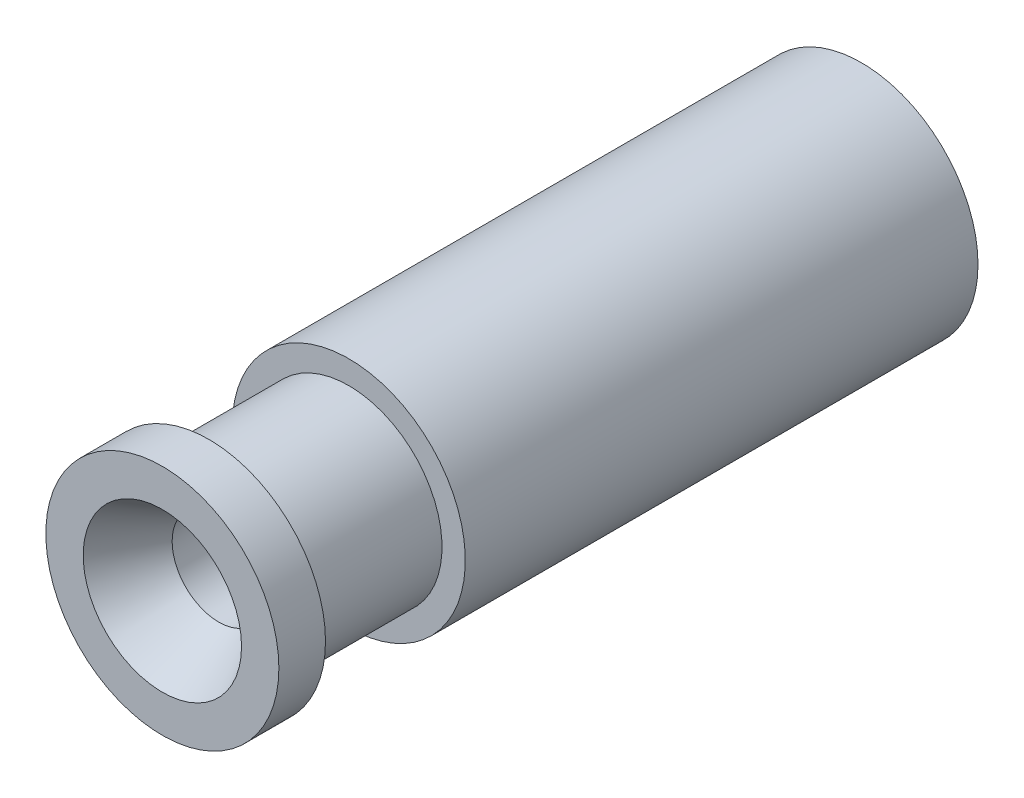
ISO-10303-21;
HEADER;
FILE_DESCRIPTION(('STEP AP214'),'2;1');
FILE_NAME('part.step','',(''),(''),'','','');
FILE_SCHEMA(('AUTOMOTIVE_DESIGN { 1 0 10303 214 1 1 1 1 }'));
ENDSEC;
DATA;
#1=APPLICATION_CONTEXT('core data for automotive mechanical design processes');
#2=APPLICATION_PROTOCOL_DEFINITION('international standard','automotive_design',2000,#1);
#3=PRODUCT_CONTEXT('',#1,'mechanical');
#4=PRODUCT('Part','Part','',(#3));
#5=PRODUCT_RELATED_PRODUCT_CATEGORY('part','',(#4));
#6=PRODUCT_DEFINITION_FORMATION('','',#4);
#7=PRODUCT_DEFINITION_CONTEXT('part definition',#1,'design');
#8=PRODUCT_DEFINITION('design','',#6,#7);
#9=PRODUCT_DEFINITION_SHAPE('','',#8);
#10=(LENGTH_UNIT() NAMED_UNIT(*) SI_UNIT(.MILLI.,.METRE.));
#11=(NAMED_UNIT(*) PLANE_ANGLE_UNIT() SI_UNIT($,.RADIAN.));
#12=(NAMED_UNIT(*) SI_UNIT($,.STERADIAN.) SOLID_ANGLE_UNIT());
#13=UNCERTAINTY_MEASURE_WITH_UNIT(LENGTH_MEASURE(1.E-05),#10,'distance_accuracy_value','');
#14=(GEOMETRIC_REPRESENTATION_CONTEXT(3) GLOBAL_UNCERTAINTY_ASSIGNED_CONTEXT((#13)) GLOBAL_UNIT_ASSIGNED_CONTEXT((#10,
#11,#12)) REPRESENTATION_CONTEXT('',''));
#15=CARTESIAN_POINT('',(0.,0.,0.));
#16=DIRECTION('',(0.,0.,1.));
#17=DIRECTION('',(1.,0.,0.));
#18=AXIS2_PLACEMENT_3D('',#15,#16,#17);
#19=CARTESIAN_POINT('',(0.,0.,15.));
#20=DIRECTION('',(0.,0.,-1.));
#21=DIRECTION('',(-1.,0.,0.));
#22=AXIS2_PLACEMENT_3D('',#19,#20,#21);
#23=CYLINDRICAL_SURFACE('',#22,2.5);
#24=CARTESIAN_POINT('',(0.,0.,14.));
#25=DIRECTION('',(0.,0.,1.));
#26=DIRECTION('',(1.,0.,0.));
#27=AXIS2_PLACEMENT_3D('',#24,#25,#26);
#28=CIRCLE('',#27,2.5);
#29=CARTESIAN_POINT('',(2.5,0.,14.));
#30=VERTEX_POINT('',#29);
#31=EDGE_CURVE('E58',#30,#30,#28,.T.);
#32=ORIENTED_EDGE('',*,*,#31,.T.);
#33=EDGE_LOOP('',(#32));
#34=FACE_BOUND('',#33,.T.);
#35=CARTESIAN_POINT('',(0.,0.,15.));
#36=DIRECTION('',(0.,0.,1.));
#37=DIRECTION('',(1.,0.,0.));
#38=AXIS2_PLACEMENT_3D('',#35,#36,#37);
#39=CIRCLE('',#38,2.5);
#40=CARTESIAN_POINT('',(2.5,0.,15.));
#41=VERTEX_POINT('',#40);
#42=EDGE_CURVE('E57',#41,#41,#39,.T.);
#43=ORIENTED_EDGE('',*,*,#42,.F.);
#44=EDGE_LOOP('',(#43));
#45=FACE_BOUND('',#44,.T.);
#46=ADVANCED_FACE('F37',(#34,#45),#23,.T.);
#47=CARTESIAN_POINT('',(0.,0.,11.));
#48=DIRECTION('',(0.,0.,-1.));
#49=DIRECTION('',(-1.,0.,0.));
#50=AXIS2_PLACEMENT_3D('',#47,#48,#49);
#51=CIRCLE('',#50,2.5);
#52=CARTESIAN_POINT('',(-2.5,0.,11.));
#53=VERTEX_POINT('',#52);
#54=EDGE_CURVE('E62',#53,#53,#51,.T.);
#55=ORIENTED_EDGE('',*,*,#54,.T.);
#56=EDGE_LOOP('',(#55));
#57=FACE_BOUND('',#56,.T.);
#58=CARTESIAN_POINT('',(0.,0.,0.));
#59=DIRECTION('',(0.,0.,1.));
#60=DIRECTION('',(1.,0.,0.));
#61=AXIS2_PLACEMENT_3D('',#58,#59,#60);
#62=CIRCLE('',#61,2.5);
#63=CARTESIAN_POINT('',(2.5,0.,0.));
#64=VERTEX_POINT('',#63);
#65=EDGE_CURVE('E69',#64,#64,#62,.T.);
#66=ORIENTED_EDGE('',*,*,#65,.T.);
#67=EDGE_LOOP('',(#66));
#68=FACE_BOUND('',#67,.T.);
#69=ADVANCED_FACE('F101',(#57,#68),#23,.T.);
#70=CARTESIAN_POINT('',(0.,0.,15.));
#71=DIRECTION('',(0.,0.,1.));
#72=DIRECTION('',(1.,0.,0.));
#73=AXIS2_PLACEMENT_3D('',#70,#71,#72);
#74=PLANE('',#73);
#75=CARTESIAN_POINT('',(0.,0.,15.));
#76=DIRECTION('',(0.,0.,1.));
#77=DIRECTION('',(1.,0.,0.));
#78=AXIS2_PLACEMENT_3D('',#75,#76,#77);
#79=CIRCLE('',#78,1.69859382571945);
#80=CARTESIAN_POINT('',(1.69859382571945,0.,15.));
#81=VERTEX_POINT('',#80);
#82=EDGE_CURVE('E44',#81,#81,#79,.F.);
#83=ORIENTED_EDGE('',*,*,#82,.T.);
#84=EDGE_LOOP('',(#83));
#85=FACE_BOUND('',#84,.T.);
#86=ORIENTED_EDGE('',*,*,#42,.T.);
#87=EDGE_LOOP('',(#86));
#88=FACE_BOUND('',#87,.T.);
#89=ADVANCED_FACE('F105',(#85,#88),#74,.T.);
#90=CARTESIAN_POINT('',(0.,0.,0.));
#91=DIRECTION('',(0.,0.,1.));
#92=DIRECTION('',(1.,0.,0.));
#93=AXIS2_PLACEMENT_3D('',#90,#91,#92);
#94=PLANE('',#93);
#95=CARTESIAN_POINT('',(0.,0.,0.));
#96=DIRECTION('',(0.,0.,1.));
#97=DIRECTION('',(1.,0.,0.));
#98=AXIS2_PLACEMENT_3D('',#95,#96,#97);
#99=CIRCLE('',#98,2.15);
#100=CARTESIAN_POINT('',(2.15,0.,0.));
#101=VERTEX_POINT('',#100);
#102=EDGE_CURVE('E48',#101,#101,#99,.T.);
#103=ORIENTED_EDGE('',*,*,#102,.T.);
#104=EDGE_LOOP('',(#103));
#105=FACE_BOUND('',#104,.T.);
#106=ORIENTED_EDGE('',*,*,#65,.F.);
#107=EDGE_LOOP('',(#106));
#108=FACE_BOUND('',#107,.T.);
#109=ADVANCED_FACE('F107',(#105,#108),#94,.F.);
#110=CARTESIAN_POINT('',(0.,0.,15.));
#111=DIRECTION('',(0.,0.,-1.));
#112=DIRECTION('',(-1.,0.,0.));
#113=AXIS2_PLACEMENT_3D('',#110,#111,#112);
#114=CYLINDRICAL_SURFACE('',#113,1.);
#115=CARTESIAN_POINT('',(0.,0.,13.79));
#116=DIRECTION('',(0.,0.,1.));
#117=DIRECTION('',(1.,0.,0.));
#118=AXIS2_PLACEMENT_3D('',#115,#116,#117);
#119=CIRCLE('',#118,1.);
#120=CARTESIAN_POINT('',(1.,0.,13.79));
#121=VERTEX_POINT('',#120);
#122=EDGE_CURVE('E10',#121,#121,#119,.T.);
#123=ORIENTED_EDGE('',*,*,#122,.T.);
#124=EDGE_LOOP('',(#123));
#125=FACE_BOUND('',#124,.T.);
#126=CARTESIAN_POINT('',(0.,0.,9.39055940236791));
#127=DIRECTION('',(0.,0.,-1.));
#128=DIRECTION('',(-1.,0.,0.));
#129=AXIS2_PLACEMENT_3D('',#126,#127,#128);
#130=CIRCLE('',#129,1.);
#131=CARTESIAN_POINT('',(-1.,0.,9.39055940236791));
#132=VERTEX_POINT('',#131);
#133=EDGE_CURVE('E66',#132,#132,#130,.T.);
#134=ORIENTED_EDGE('',*,*,#133,.T.);
#135=EDGE_LOOP('',(#134));
#136=FACE_BOUND('',#135,.T.);
#137=ADVANCED_FACE('F113',(#125,#136),#114,.F.);
#138=CARTESIAN_POINT('',(0.,0.,9.));
#139=DIRECTION('',(0.,0.,-1.));
#140=DIRECTION('',(-1.,0.,0.));
#141=AXIS2_PLACEMENT_3D('',#138,#139,#140);
#142=CONICAL_SURFACE('',#141,1.65,1.02974425867665);
#143=CARTESIAN_POINT('',(0.,0.,9.));
#144=DIRECTION('',(0.,0.,-1.));
#145=DIRECTION('',(-1.,0.,0.));
#146=AXIS2_PLACEMENT_3D('',#143,#144,#145);
#147=CIRCLE('',#146,1.65);
#148=CARTESIAN_POINT('',(-1.65,0.,9.));
#149=VERTEX_POINT('',#148);
#150=EDGE_CURVE('E61',#149,#149,#147,.T.);
#151=ORIENTED_EDGE('',*,*,#150,.T.);
#152=EDGE_LOOP('',(#151));
#153=FACE_BOUND('',#152,.T.);
#154=ORIENTED_EDGE('',*,*,#133,.F.);
#155=EDGE_LOOP('',(#154));
#156=FACE_BOUND('',#155,.T.);
#157=ADVANCED_FACE('F131',(#153,#156),#142,.F.);
#158=CARTESIAN_POINT('',(0.,0.,0.));
#159=DIRECTION('',(0.,0.,-1.));
#160=DIRECTION('',(-1.,0.,0.));
#161=AXIS2_PLACEMENT_3D('',#158,#159,#160);
#162=CYLINDRICAL_SURFACE('',#161,1.65);
#163=CARTESIAN_POINT('',(0.,0.,0.866025403784435));
#164=DIRECTION('',(0.,0.,1.));
#165=DIRECTION('',(1.,0.,0.));
#166=AXIS2_PLACEMENT_3D('',#163,#164,#165);
#167=CIRCLE('',#166,1.65);
#168=CARTESIAN_POINT('',(1.65,0.,0.866025403784435));
#169=VERTEX_POINT('',#168);
#170=EDGE_CURVE('E52',#169,#169,#167,.F.);
#171=ORIENTED_EDGE('',*,*,#170,.T.);
#172=EDGE_LOOP('',(#171));
#173=FACE_BOUND('',#172,.T.);
#174=ORIENTED_EDGE('',*,*,#150,.F.);
#175=EDGE_LOOP('',(#174));
#176=FACE_BOUND('',#175,.T.);
#177=ADVANCED_FACE('F95',(#173,#176),#162,.F.);
#178=CARTESIAN_POINT('',(0.,-3.79379159500485,14.));
#179=DIRECTION('',(0.,0.,1.));
#180=DIRECTION('',(1.,0.,0.));
#181=AXIS2_PLACEMENT_3D('',#178,#179,#180);
#182=PLANE('',#181);
#183=CARTESIAN_POINT('',(0.,0.,14.));
#184=DIRECTION('',(0.,0.,-1.));
#185=DIRECTION('',(-1.,0.,0.));
#186=AXIS2_PLACEMENT_3D('',#183,#184,#185);
#187=CIRCLE('',#186,2.);
#188=CARTESIAN_POINT('',(-2.,0.,14.));
#189=VERTEX_POINT('',#188);
#190=EDGE_CURVE('E65',#189,#189,#187,.T.);
#191=ORIENTED_EDGE('',*,*,#190,.F.);
#192=EDGE_LOOP('',(#191));
#193=FACE_BOUND('',#192,.T.);
#194=ORIENTED_EDGE('',*,*,#31,.F.);
#195=EDGE_LOOP('',(#194));
#196=FACE_BOUND('',#195,.T.);
#197=ADVANCED_FACE('F92',(#193,#196),#182,.F.);
#198=CARTESIAN_POINT('',(0.,-3.79379159500486,11.));
#199=DIRECTION('',(0.,0.,-1.));
#200=DIRECTION('',(-1.,0.,0.));
#201=AXIS2_PLACEMENT_3D('',#198,#199,#200);
#202=PLANE('',#201);
#203=CARTESIAN_POINT('',(0.,0.,11.));
#204=DIRECTION('',(0.,0.,-1.));
#205=DIRECTION('',(-1.,0.,0.));
#206=AXIS2_PLACEMENT_3D('',#203,#204,#205);
#207=CIRCLE('',#206,2.);
#208=CARTESIAN_POINT('',(-2.,0.,11.));
#209=VERTEX_POINT('',#208);
#210=EDGE_CURVE('E78',#209,#209,#207,.T.);
#211=ORIENTED_EDGE('',*,*,#210,.T.);
#212=EDGE_LOOP('',(#211));
#213=FACE_BOUND('',#212,.T.);
#214=ORIENTED_EDGE('',*,*,#54,.F.);
#215=EDGE_LOOP('',(#214));
#216=FACE_BOUND('',#215,.T.);
#217=ADVANCED_FACE('F82',(#213,#216),#202,.F.);
#218=CARTESIAN_POINT('',(0.,0.,0.));
#219=DIRECTION('',(0.,0.,-1.));
#220=DIRECTION('',(-1.,0.,0.));
#221=AXIS2_PLACEMENT_3D('',#218,#219,#220);
#222=CYLINDRICAL_SURFACE('',#221,2.);
#223=ORIENTED_EDGE('',*,*,#210,.F.);
#224=EDGE_LOOP('',(#223));
#225=FACE_BOUND('',#224,.T.);
#226=ORIENTED_EDGE('',*,*,#190,.T.);
#227=EDGE_LOOP('',(#226));
#228=FACE_BOUND('',#227,.T.);
#229=ADVANCED_FACE('F85',(#225,#228),#222,.T.);
#230=CARTESIAN_POINT('',(0.,0.,0.866025403784435));
#231=DIRECTION('',(0.,0.,-1.));
#232=DIRECTION('',(-1.,0.,0.));
#233=AXIS2_PLACEMENT_3D('',#230,#231,#232);
#234=CONICAL_SURFACE('',#233,1.65,0.5235987755983);
#235=ORIENTED_EDGE('',*,*,#102,.F.);
#236=EDGE_LOOP('',(#235));
#237=FACE_BOUND('',#236,.T.);
#238=ORIENTED_EDGE('',*,*,#170,.F.);
#239=EDGE_LOOP('',(#238));
#240=FACE_BOUND('',#239,.T.);
#241=ADVANCED_FACE('F88',(#237,#240),#234,.F.);
#242=CARTESIAN_POINT('',(0.,0.,15.));
#243=DIRECTION('',(0.,0.,1.));
#244=DIRECTION('',(1.,0.,0.));
#245=AXIS2_PLACEMENT_3D('',#242,#243,#244);
#246=CONICAL_SURFACE('',#245,1.69859382571945,0.523598775598297);
#247=ORIENTED_EDGE('',*,*,#122,.F.);
#248=EDGE_LOOP('',(#247));
#249=FACE_BOUND('',#248,.T.);
#250=ORIENTED_EDGE('',*,*,#82,.F.);
#251=EDGE_LOOP('',(#250));
#252=FACE_BOUND('',#251,.T.);
#253=ADVANCED_FACE('F39',(#249,#252),#246,.F.);
#254=CLOSED_SHELL('',(#46,#69,#89,#109,#137,#157,#177,#197,#217,#229,#241,#253));
#255=MANIFOLD_SOLID_BREP('B2',#254);
#256=ADVANCED_BREP_SHAPE_REPRESENTATION('',(#18,#255),#14);
#257=SHAPE_DEFINITION_REPRESENTATION(#9,#256);
ENDSEC;
END-ISO-10303-21;
